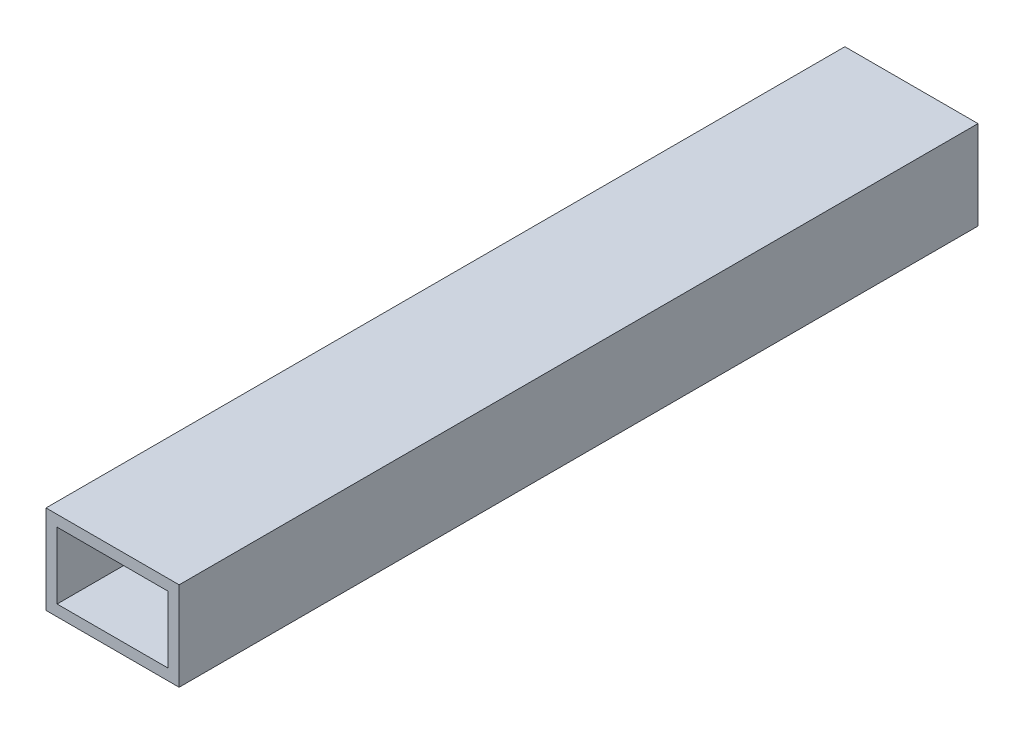
ISO-10303-21;
HEADER;
FILE_DESCRIPTION(('STEP AP214'),'2;1');
FILE_NAME('part.step','',(''),(''),'','','');
FILE_SCHEMA(('AUTOMOTIVE_DESIGN { 1 0 10303 214 1 1 1 1 }'));
ENDSEC;
DATA;
#1=APPLICATION_CONTEXT('core data for automotive mechanical design processes');
#2=APPLICATION_PROTOCOL_DEFINITION('international standard','automotive_design',2000,#1);
#3=PRODUCT_CONTEXT('',#1,'mechanical');
#4=PRODUCT('Part','Part','',(#3));
#5=PRODUCT_RELATED_PRODUCT_CATEGORY('part','',(#4));
#6=PRODUCT_DEFINITION_FORMATION('','',#4);
#7=PRODUCT_DEFINITION_CONTEXT('part definition',#1,'design');
#8=PRODUCT_DEFINITION('design','',#6,#7);
#9=PRODUCT_DEFINITION_SHAPE('','',#8);
#10=(LENGTH_UNIT() NAMED_UNIT(*) SI_UNIT(.MILLI.,.METRE.));
#11=(NAMED_UNIT(*) PLANE_ANGLE_UNIT() SI_UNIT($,.RADIAN.));
#12=(NAMED_UNIT(*) SI_UNIT($,.STERADIAN.) SOLID_ANGLE_UNIT());
#13=UNCERTAINTY_MEASURE_WITH_UNIT(LENGTH_MEASURE(1.E-05),#10,'distance_accuracy_value','');
#14=(GEOMETRIC_REPRESENTATION_CONTEXT(3) GLOBAL_UNCERTAINTY_ASSIGNED_CONTEXT((#13)) GLOBAL_UNIT_ASSIGNED_CONTEXT((#10,
#11,#12)) REPRESENTATION_CONTEXT('',''));
#15=CARTESIAN_POINT('',(0.,0.,0.));
#16=DIRECTION('',(0.,0.,1.));
#17=DIRECTION('',(1.,0.,0.));
#18=AXIS2_PLACEMENT_3D('',#15,#16,#17);
#19=CARTESIAN_POINT('',(0.,0.,114.3));
#20=DIRECTION('',(0.,0.,1.));
#21=DIRECTION('',(1.,0.,0.));
#22=AXIS2_PLACEMENT_3D('',#19,#20,#21);
#23=PLANE('',#22);
#24=DIRECTION('',(0.,-1.,0.));
#25=VECTOR('',#24,1.);
#26=CARTESIAN_POINT('',(-19.05,-12.7,114.3));
#27=LINE('',#26,#25);
#28=CARTESIAN_POINT('',(-19.05,12.7,114.3));
#29=VERTEX_POINT('',#28);
#30=CARTESIAN_POINT('',(-19.05,-12.7,114.3));
#31=VERTEX_POINT('',#30);
#32=EDGE_CURVE('E117',#29,#31,#27,.T.);
#33=ORIENTED_EDGE('',*,*,#32,.T.);
#34=DIRECTION('',(1.,0.,0.));
#35=VECTOR('',#34,1.);
#36=CARTESIAN_POINT('',(19.05,-12.7,114.3));
#37=LINE('',#36,#35);
#38=CARTESIAN_POINT('',(19.05,-12.7,114.3));
#39=VERTEX_POINT('',#38);
#40=EDGE_CURVE('E176',#31,#39,#37,.T.);
#41=ORIENTED_EDGE('',*,*,#40,.T.);
#42=DIRECTION('',(0.,1.,0.));
#43=VECTOR('',#42,1.);
#44=CARTESIAN_POINT('',(19.05,-12.7,114.3));
#45=LINE('',#44,#43);
#46=CARTESIAN_POINT('',(19.05,12.7,114.3));
#47=VERTEX_POINT('',#46);
#48=EDGE_CURVE('E179',#39,#47,#45,.T.);
#49=ORIENTED_EDGE('',*,*,#48,.T.);
#50=DIRECTION('',(-1.,0.,0.));
#51=VECTOR('',#50,1.);
#52=CARTESIAN_POINT('',(19.05,12.7,114.3));
#53=LINE('',#52,#51);
#54=EDGE_CURVE('E63',#47,#29,#53,.T.);
#55=ORIENTED_EDGE('',*,*,#54,.T.);
#56=EDGE_LOOP('',(#33,#41,#49,#55));
#57=FACE_BOUND('',#56,.T.);
#58=DIRECTION('',(1.,0.,0.));
#59=VECTOR('',#58,1.);
#60=CARTESIAN_POINT('',(15.875,-9.525,114.3));
#61=LINE('',#60,#59);
#62=CARTESIAN_POINT('',(-15.875,-9.525,114.3));
#63=VERTEX_POINT('',#62);
#64=CARTESIAN_POINT('',(15.875,-9.525,114.3));
#65=VERTEX_POINT('',#64);
#66=EDGE_CURVE('E158',#63,#65,#61,.T.);
#67=ORIENTED_EDGE('',*,*,#66,.F.);
#68=DIRECTION('',(0.,-1.,0.));
#69=VECTOR('',#68,1.);
#70=CARTESIAN_POINT('',(-15.875,-9.525,114.3));
#71=LINE('',#70,#69);
#72=CARTESIAN_POINT('',(-15.875,9.525,114.3));
#73=VERTEX_POINT('',#72);
#74=EDGE_CURVE('E113',#73,#63,#71,.T.);
#75=ORIENTED_EDGE('',*,*,#74,.F.);
#76=DIRECTION('',(-1.,0.,0.));
#77=VECTOR('',#76,1.);
#78=CARTESIAN_POINT('',(15.875,9.525,114.3));
#79=LINE('',#78,#77);
#80=CARTESIAN_POINT('',(15.875,9.525,114.3));
#81=VERTEX_POINT('',#80);
#82=EDGE_CURVE('E164',#81,#73,#79,.T.);
#83=ORIENTED_EDGE('',*,*,#82,.F.);
#84=DIRECTION('',(0.,1.,0.));
#85=VECTOR('',#84,1.);
#86=CARTESIAN_POINT('',(15.875,-9.525,114.3));
#87=LINE('',#86,#85);
#88=EDGE_CURVE('E161',#65,#81,#87,.T.);
#89=ORIENTED_EDGE('',*,*,#88,.F.);
#90=EDGE_LOOP('',(#67,#75,#83,#89));
#91=FACE_BOUND('',#90,.T.);
#92=ADVANCED_FACE('F39',(#57,#91),#23,.T.);
#93=CARTESIAN_POINT('',(-19.05,-12.7,114.3));
#94=DIRECTION('',(1.,0.,0.));
#95=DIRECTION('',(0.,0.,-1.));
#96=AXIS2_PLACEMENT_3D('',#93,#94,#95);
#97=PLANE('',#96);
#98=DIRECTION('',(0.,0.,-1.));
#99=VECTOR('',#98,1.);
#100=CARTESIAN_POINT('',(-19.05,12.7,114.3));
#101=LINE('',#100,#99);
#102=CARTESIAN_POINT('',(-19.05,12.7,-114.3));
#103=VERTEX_POINT('',#102);
#104=EDGE_CURVE('E184',#29,#103,#101,.T.);
#105=ORIENTED_EDGE('',*,*,#104,.T.);
#106=DIRECTION('',(0.,-1.,0.));
#107=VECTOR('',#106,1.);
#108=CARTESIAN_POINT('',(-19.05,-12.7,-114.3));
#109=LINE('',#108,#107);
#110=CARTESIAN_POINT('',(-19.05,-12.7,-114.3));
#111=VERTEX_POINT('',#110);
#112=EDGE_CURVE('E140',#103,#111,#109,.T.);
#113=ORIENTED_EDGE('',*,*,#112,.T.);
#114=DIRECTION('',(0.,0.,-1.));
#115=VECTOR('',#114,1.);
#116=CARTESIAN_POINT('',(-19.05,-12.7,114.3));
#117=LINE('',#116,#115);
#118=EDGE_CURVE('E11',#31,#111,#117,.T.);
#119=ORIENTED_EDGE('',*,*,#118,.F.);
#120=ORIENTED_EDGE('',*,*,#32,.F.);
#121=EDGE_LOOP('',(#105,#113,#119,#120));
#122=FACE_BOUND('',#121,.T.);
#123=ADVANCED_FACE('F41',(#122),#97,.F.);
#124=CARTESIAN_POINT('',(19.05,-12.7,114.3));
#125=DIRECTION('',(0.,1.,0.));
#126=DIRECTION('',(0.,0.,1.));
#127=AXIS2_PLACEMENT_3D('',#124,#125,#126);
#128=PLANE('',#127);
#129=ORIENTED_EDGE('',*,*,#118,.T.);
#130=DIRECTION('',(1.,0.,0.));
#131=VECTOR('',#130,1.);
#132=CARTESIAN_POINT('',(19.05,-12.7,-114.3));
#133=LINE('',#132,#131);
#134=CARTESIAN_POINT('',(19.05,-12.7,-114.3));
#135=VERTEX_POINT('',#134);
#136=EDGE_CURVE('E144',#111,#135,#133,.T.);
#137=ORIENTED_EDGE('',*,*,#136,.T.);
#138=DIRECTION('',(0.,0.,-1.));
#139=VECTOR('',#138,1.);
#140=CARTESIAN_POINT('',(19.05,-12.7,114.3));
#141=LINE('',#140,#139);
#142=EDGE_CURVE('E48',#39,#135,#141,.T.);
#143=ORIENTED_EDGE('',*,*,#142,.F.);
#144=ORIENTED_EDGE('',*,*,#40,.F.);
#145=EDGE_LOOP('',(#129,#137,#143,#144));
#146=FACE_BOUND('',#145,.T.);
#147=ADVANCED_FACE('F200',(#146),#128,.F.);
#148=CARTESIAN_POINT('',(19.05,-12.7,114.3));
#149=DIRECTION('',(-1.,0.,0.));
#150=DIRECTION('',(0.,-1.,0.));
#151=AXIS2_PLACEMENT_3D('',#148,#149,#150);
#152=PLANE('',#151);
#153=ORIENTED_EDGE('',*,*,#142,.T.);
#154=DIRECTION('',(0.,1.,0.));
#155=VECTOR('',#154,1.);
#156=CARTESIAN_POINT('',(19.05,-12.7,-114.3));
#157=LINE('',#156,#155);
#158=CARTESIAN_POINT('',(19.05,12.7,-114.3));
#159=VERTEX_POINT('',#158);
#160=EDGE_CURVE('E148',#135,#159,#157,.T.);
#161=ORIENTED_EDGE('',*,*,#160,.T.);
#162=DIRECTION('',(0.,0.,-1.));
#163=VECTOR('',#162,1.);
#164=CARTESIAN_POINT('',(19.05,12.7,114.3));
#165=LINE('',#164,#163);
#166=EDGE_CURVE('E187',#47,#159,#165,.T.);
#167=ORIENTED_EDGE('',*,*,#166,.F.);
#168=ORIENTED_EDGE('',*,*,#48,.F.);
#169=EDGE_LOOP('',(#153,#161,#167,#168));
#170=FACE_BOUND('',#169,.T.);
#171=ADVANCED_FACE('F194',(#170),#152,.F.);
#172=CARTESIAN_POINT('',(19.05,12.7,114.3));
#173=DIRECTION('',(0.,-1.,0.));
#174=DIRECTION('',(0.,0.,-1.));
#175=AXIS2_PLACEMENT_3D('',#172,#173,#174);
#176=PLANE('',#175);
#177=ORIENTED_EDGE('',*,*,#166,.T.);
#178=DIRECTION('',(-1.,0.,0.));
#179=VECTOR('',#178,1.);
#180=CARTESIAN_POINT('',(19.05,12.7,-114.3));
#181=LINE('',#180,#179);
#182=EDGE_CURVE('E152',#159,#103,#181,.T.);
#183=ORIENTED_EDGE('',*,*,#182,.T.);
#184=ORIENTED_EDGE('',*,*,#104,.F.);
#185=ORIENTED_EDGE('',*,*,#54,.F.);
#186=EDGE_LOOP('',(#177,#183,#184,#185));
#187=FACE_BOUND('',#186,.T.);
#188=ADVANCED_FACE('F205',(#187),#176,.F.);
#189=CARTESIAN_POINT('',(-15.875,-9.525,114.3));
#190=DIRECTION('',(1.,0.,0.));
#191=DIRECTION('',(0.,0.,-1.));
#192=AXIS2_PLACEMENT_3D('',#189,#190,#191);
#193=PLANE('',#192);
#194=DIRECTION('',(0.,0.,-1.));
#195=VECTOR('',#194,1.);
#196=CARTESIAN_POINT('',(-15.875,-9.525,114.3));
#197=LINE('',#196,#195);
#198=CARTESIAN_POINT('',(-15.875,-9.525,-114.3));
#199=VERTEX_POINT('',#198);
#200=EDGE_CURVE('E105',#63,#199,#197,.T.);
#201=ORIENTED_EDGE('',*,*,#200,.T.);
#202=DIRECTION('',(0.,-1.,0.));
#203=VECTOR('',#202,1.);
#204=CARTESIAN_POINT('',(-15.875,-9.525,-114.3));
#205=LINE('',#204,#203);
#206=CARTESIAN_POINT('',(-15.875,9.525,-114.3));
#207=VERTEX_POINT('',#206);
#208=EDGE_CURVE('E110',#207,#199,#205,.T.);
#209=ORIENTED_EDGE('',*,*,#208,.F.);
#210=DIRECTION('',(0.,0.,-1.));
#211=VECTOR('',#210,1.);
#212=CARTESIAN_POINT('',(-15.875,9.525,114.3));
#213=LINE('',#212,#211);
#214=EDGE_CURVE('E167',#73,#207,#213,.T.);
#215=ORIENTED_EDGE('',*,*,#214,.F.);
#216=ORIENTED_EDGE('',*,*,#74,.T.);
#217=EDGE_LOOP('',(#201,#209,#215,#216));
#218=FACE_BOUND('',#217,.T.);
#219=ADVANCED_FACE('F107',(#218),#193,.T.);
#220=CARTESIAN_POINT('',(15.875,-9.525,114.3));
#221=DIRECTION('',(0.,1.,0.));
#222=DIRECTION('',(0.,0.,1.));
#223=AXIS2_PLACEMENT_3D('',#220,#221,#222);
#224=PLANE('',#223);
#225=DIRECTION('',(0.,0.,-1.));
#226=VECTOR('',#225,1.);
#227=CARTESIAN_POINT('',(15.875,-9.525,114.3));
#228=LINE('',#227,#226);
#229=CARTESIAN_POINT('',(15.875,-9.525,-114.3));
#230=VERTEX_POINT('',#229);
#231=EDGE_CURVE('E118',#65,#230,#228,.T.);
#232=ORIENTED_EDGE('',*,*,#231,.T.);
#233=DIRECTION('',(1.,0.,0.));
#234=VECTOR('',#233,1.);
#235=CARTESIAN_POINT('',(15.875,-9.525,-114.3));
#236=LINE('',#235,#234);
#237=EDGE_CURVE('E121',#199,#230,#236,.T.);
#238=ORIENTED_EDGE('',*,*,#237,.F.);
#239=ORIENTED_EDGE('',*,*,#200,.F.);
#240=ORIENTED_EDGE('',*,*,#66,.T.);
#241=EDGE_LOOP('',(#232,#238,#239,#240));
#242=FACE_BOUND('',#241,.T.);
#243=ADVANCED_FACE('F122',(#242),#224,.T.);
#244=CARTESIAN_POINT('',(15.875,-9.525,114.3));
#245=DIRECTION('',(-1.,0.,0.));
#246=DIRECTION('',(0.,0.,1.));
#247=AXIS2_PLACEMENT_3D('',#244,#245,#246);
#248=PLANE('',#247);
#249=DIRECTION('',(0.,0.,-1.));
#250=VECTOR('',#249,1.);
#251=CARTESIAN_POINT('',(15.875,9.525,114.3));
#252=LINE('',#251,#250);
#253=CARTESIAN_POINT('',(15.875,9.525,-114.3));
#254=VERTEX_POINT('',#253);
#255=EDGE_CURVE('E55',#81,#254,#252,.T.);
#256=ORIENTED_EDGE('',*,*,#255,.T.);
#257=DIRECTION('',(0.,1.,0.));
#258=VECTOR('',#257,1.);
#259=CARTESIAN_POINT('',(15.875,-9.525,-114.3));
#260=LINE('',#259,#258);
#261=EDGE_CURVE('E128',#230,#254,#260,.T.);
#262=ORIENTED_EDGE('',*,*,#261,.F.);
#263=ORIENTED_EDGE('',*,*,#231,.F.);
#264=ORIENTED_EDGE('',*,*,#88,.T.);
#265=EDGE_LOOP('',(#256,#262,#263,#264));
#266=FACE_BOUND('',#265,.T.);
#267=ADVANCED_FACE('F223',(#266),#248,.T.);
#268=CARTESIAN_POINT('',(15.875,9.525,114.3));
#269=DIRECTION('',(0.,-1.,0.));
#270=DIRECTION('',(1.,0.,0.));
#271=AXIS2_PLACEMENT_3D('',#268,#269,#270);
#272=PLANE('',#271);
#273=ORIENTED_EDGE('',*,*,#214,.T.);
#274=DIRECTION('',(-1.,0.,0.));
#275=VECTOR('',#274,1.);
#276=CARTESIAN_POINT('',(15.875,9.525,-114.3));
#277=LINE('',#276,#275);
#278=EDGE_CURVE('E132',#254,#207,#277,.T.);
#279=ORIENTED_EDGE('',*,*,#278,.F.);
#280=ORIENTED_EDGE('',*,*,#255,.F.);
#281=ORIENTED_EDGE('',*,*,#82,.T.);
#282=EDGE_LOOP('',(#273,#279,#280,#281));
#283=FACE_BOUND('',#282,.T.);
#284=ADVANCED_FACE('F226',(#283),#272,.T.);
#285=CARTESIAN_POINT('',(0.,0.,-114.3));
#286=DIRECTION('',(0.,0.,1.));
#287=DIRECTION('',(1.,0.,0.));
#288=AXIS2_PLACEMENT_3D('',#285,#286,#287);
#289=PLANE('',#288);
#290=ORIENTED_EDGE('',*,*,#278,.T.);
#291=ORIENTED_EDGE('',*,*,#208,.T.);
#292=ORIENTED_EDGE('',*,*,#237,.T.);
#293=ORIENTED_EDGE('',*,*,#261,.T.);
#294=EDGE_LOOP('',(#290,#291,#292,#293));
#295=FACE_BOUND('',#294,.T.);
#296=ORIENTED_EDGE('',*,*,#112,.F.);
#297=ORIENTED_EDGE('',*,*,#182,.F.);
#298=ORIENTED_EDGE('',*,*,#160,.F.);
#299=ORIENTED_EDGE('',*,*,#136,.F.);
#300=EDGE_LOOP('',(#296,#297,#298,#299));
#301=FACE_BOUND('',#300,.T.);
#302=ADVANCED_FACE('F130',(#295,#301),#289,.F.);
#303=CLOSED_SHELL('',(#92,#123,#147,#171,#188,#219,#243,#267,#284,#302));
#304=MANIFOLD_SOLID_BREP('B2',#303);
#305=ADVANCED_BREP_SHAPE_REPRESENTATION('',(#18,#304),#14);
#306=SHAPE_DEFINITION_REPRESENTATION(#9,#305);
ENDSEC;
END-ISO-10303-21;
